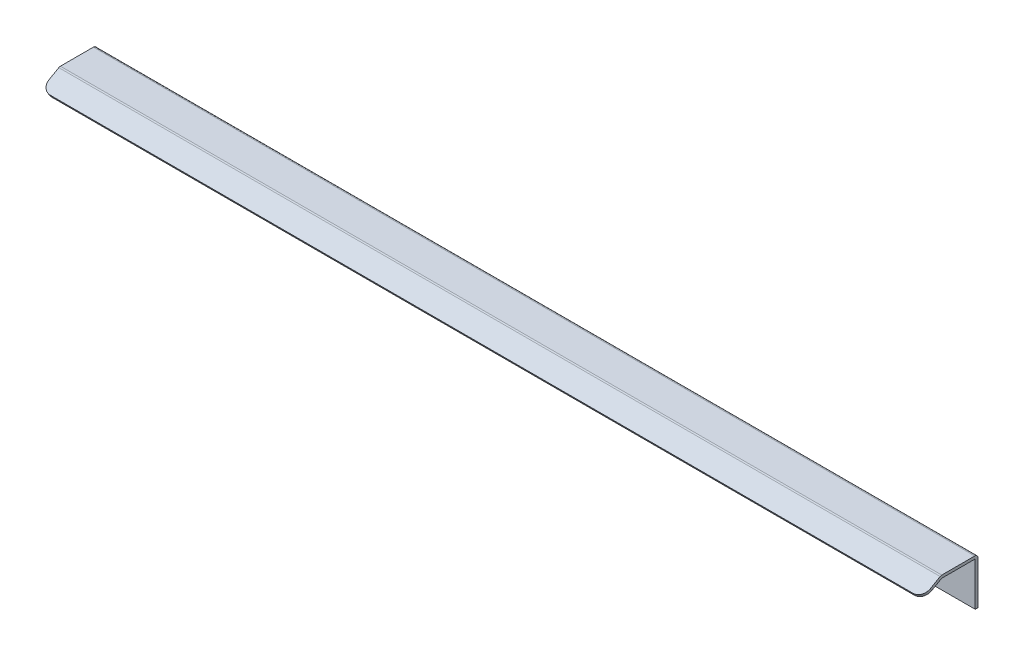
ISO-10303-21;
HEADER;
FILE_DESCRIPTION(('STEP AP214'),'2;1');
FILE_NAME('part.step','',(''),(''),'','','');
FILE_SCHEMA(('AUTOMOTIVE_DESIGN { 1 0 10303 214 1 1 1 1 }'));
ENDSEC;
DATA;
#1=APPLICATION_CONTEXT('core data for automotive mechanical design processes');
#2=APPLICATION_PROTOCOL_DEFINITION('international standard','automotive_design',2000,#1);
#3=PRODUCT_CONTEXT('',#1,'mechanical');
#4=PRODUCT('Part','Part','',(#3));
#5=PRODUCT_RELATED_PRODUCT_CATEGORY('part','',(#4));
#6=PRODUCT_DEFINITION_FORMATION('','',#4);
#7=PRODUCT_DEFINITION_CONTEXT('part definition',#1,'design');
#8=PRODUCT_DEFINITION('design','',#6,#7);
#9=PRODUCT_DEFINITION_SHAPE('','',#8);
#10=(LENGTH_UNIT() NAMED_UNIT(*) SI_UNIT(.MILLI.,.METRE.));
#11=(NAMED_UNIT(*) PLANE_ANGLE_UNIT() SI_UNIT($,.RADIAN.));
#12=(NAMED_UNIT(*) SI_UNIT($,.STERADIAN.) SOLID_ANGLE_UNIT());
#13=UNCERTAINTY_MEASURE_WITH_UNIT(LENGTH_MEASURE(1.E-05),#10,'distance_accuracy_value','');
#14=(GEOMETRIC_REPRESENTATION_CONTEXT(3) GLOBAL_UNCERTAINTY_ASSIGNED_CONTEXT((#13)) GLOBAL_UNIT_ASSIGNED_CONTEXT((#10,
#11,#12)) REPRESENTATION_CONTEXT('',''));
#15=CARTESIAN_POINT('',(0.,0.,0.));
#16=DIRECTION('',(0.,0.,1.));
#17=DIRECTION('',(1.,0.,0.));
#18=AXIS2_PLACEMENT_3D('',#15,#16,#17);
#19=CARTESIAN_POINT('',(949.6,46.5,0.));
#20=DIRECTION('',(1.,0.,0.));
#21=DIRECTION('',(0.,0.,-1.));
#22=AXIS2_PLACEMENT_3D('',#19,#20,#21);
#23=PLANE('',#22);
#24=CARTESIAN_POINT('',(949.6,46.5,3.5));
#25=DIRECTION('',(1.,0.,0.));
#26=DIRECTION('',(0.,1.,0.));
#27=AXIS2_PLACEMENT_3D('',#24,#25,#26);
#28=CIRCLE('',#27,0.5);
#29=CARTESIAN_POINT('',(949.6,46.5,3.));
#30=VERTEX_POINT('',#29);
#31=CARTESIAN_POINT('',(949.6,47.,3.5));
#32=VERTEX_POINT('',#31);
#33=EDGE_CURVE('E191',#30,#32,#28,.T.);
#34=ORIENTED_EDGE('',*,*,#33,.F.);
#35=DIRECTION('',(0.,1.,0.));
#36=VECTOR('',#35,1.);
#37=CARTESIAN_POINT('',(949.6,0.,3.));
#38=LINE('',#37,#36);
#39=CARTESIAN_POINT('',(949.6,0.,3.));
#40=VERTEX_POINT('',#39);
#41=EDGE_CURVE('E195',#40,#30,#38,.T.);
#42=ORIENTED_EDGE('',*,*,#41,.F.);
#43=DIRECTION('',(0.,0.,1.));
#44=VECTOR('',#43,1.);
#45=CARTESIAN_POINT('',(949.6,0.,0.));
#46=LINE('',#45,#44);
#47=CARTESIAN_POINT('',(949.6,0.,0.));
#48=VERTEX_POINT('',#47);
#49=EDGE_CURVE('E138',#48,#40,#46,.T.);
#50=ORIENTED_EDGE('',*,*,#49,.F.);
#51=DIRECTION('',(0.,1.,0.));
#52=VECTOR('',#51,1.);
#53=CARTESIAN_POINT('',(949.6,0.,0.));
#54=LINE('',#53,#52);
#55=CARTESIAN_POINT('',(949.6,46.5,0.));
#56=VERTEX_POINT('',#55);
#57=EDGE_CURVE('E25',#48,#56,#54,.T.);
#58=ORIENTED_EDGE('',*,*,#57,.T.);
#59=CARTESIAN_POINT('',(949.6,46.5,3.5));
#60=DIRECTION('',(1.,0.,0.));
#61=DIRECTION('',(0.,0.,1.));
#62=AXIS2_PLACEMENT_3D('',#59,#60,#61);
#63=CIRCLE('',#62,3.5);
#64=CARTESIAN_POINT('',(949.6,50.,3.5));
#65=VERTEX_POINT('',#64);
#66=EDGE_CURVE('E9',#56,#65,#63,.T.);
#67=ORIENTED_EDGE('',*,*,#66,.T.);
#68=DIRECTION('',(0.,0.,1.));
#69=VECTOR('',#68,1.);
#70=CARTESIAN_POINT('',(949.6,50.,3.5));
#71=LINE('',#70,#69);
#72=CARTESIAN_POINT('',(949.6,50.,39.0621778264911));
#73=VERTEX_POINT('',#72);
#74=EDGE_CURVE('E216',#65,#73,#71,.T.);
#75=ORIENTED_EDGE('',*,*,#74,.T.);
#76=CARTESIAN_POINT('',(949.6,46.5,39.0621778264911));
#77=DIRECTION('',(1.,0.,0.));
#78=DIRECTION('',(0.,0.,1.));
#79=AXIS2_PLACEMENT_3D('',#76,#77,#78);
#80=CIRCLE('',#79,3.5);
#81=CARTESIAN_POINT('',(949.6,49.5310889132455,40.8121778264911));
#82=VERTEX_POINT('',#81);
#83=EDGE_CURVE('E214',#73,#82,#80,.T.);
#84=ORIENTED_EDGE('',*,*,#83,.T.);
#85=DIRECTION('',(0.,-0.500000000000001,0.866025403784438));
#86=VECTOR('',#85,1.);
#87=CARTESIAN_POINT('',(949.6,49.5310889132455,40.8121778264911));
#88=LINE('',#87,#86);
#89=CARTESIAN_POINT('',(949.6,43.4529946162075,51.3397459621556));
#90=VERTEX_POINT('',#89);
#91=EDGE_CURVE('E149',#82,#90,#88,.T.);
#92=ORIENTED_EDGE('',*,*,#91,.T.);
#93=DIRECTION('',(0.,-0.866025403784439,-0.499999999999999));
#94=VECTOR('',#93,1.);
#95=CARTESIAN_POINT('',(949.6,40.8549184048542,49.8397459621556));
#96=LINE('',#95,#94);
#97=CARTESIAN_POINT('',(949.6,40.8549184048542,49.8397459621556));
#98=VERTEX_POINT('',#97);
#99=EDGE_CURVE('E19',#90,#98,#96,.T.);
#100=ORIENTED_EDGE('',*,*,#99,.T.);
#101=DIRECTION('',(0.,-0.5,0.866025403784439));
#102=VECTOR('',#101,1.);
#103=CARTESIAN_POINT('',(949.6,46.9330127018922,39.3121778264911));
#104=LINE('',#103,#102);
#105=CARTESIAN_POINT('',(949.6,46.9330127018922,39.3121778264911));
#106=VERTEX_POINT('',#105);
#107=EDGE_CURVE('E177',#106,#98,#104,.T.);
#108=ORIENTED_EDGE('',*,*,#107,.F.);
#109=CARTESIAN_POINT('',(949.6,46.5,39.0621778264911));
#110=DIRECTION('',(1.,0.,0.));
#111=DIRECTION('',(0.,1.,0.));
#112=AXIS2_PLACEMENT_3D('',#109,#110,#111);
#113=CIRCLE('',#112,0.5);
#114=CARTESIAN_POINT('',(949.6,47.,39.0621778264911));
#115=VERTEX_POINT('',#114);
#116=EDGE_CURVE('E181',#115,#106,#113,.T.);
#117=ORIENTED_EDGE('',*,*,#116,.F.);
#118=DIRECTION('',(0.,0.,1.));
#119=VECTOR('',#118,1.);
#120=CARTESIAN_POINT('',(949.6,47.,3.5));
#121=LINE('',#120,#119);
#122=EDGE_CURVE('E182',#32,#115,#121,.T.);
#123=ORIENTED_EDGE('',*,*,#122,.F.);
#124=EDGE_LOOP('',(#34,#42,#50,#58,#67,#75,#84,#92,#100,#108,#117,#123));
#125=FACE_BOUND('',#124,.T.);
#126=ADVANCED_FACE('F15',(#125),#23,.T.);
#127=CARTESIAN_POINT('',(0.,50.,3.5));
#128=DIRECTION('',(-1.,0.,0.));
#129=DIRECTION('',(0.,0.,1.));
#130=AXIS2_PLACEMENT_3D('',#127,#128,#129);
#131=PLANE('',#130);
#132=CARTESIAN_POINT('',(0.,46.5,3.5));
#133=DIRECTION('',(1.,0.,0.));
#134=DIRECTION('',(0.,1.,0.));
#135=AXIS2_PLACEMENT_3D('',#132,#133,#134);
#136=CIRCLE('',#135,0.5);
#137=CARTESIAN_POINT('',(0.,46.5,3.));
#138=VERTEX_POINT('',#137);
#139=CARTESIAN_POINT('',(0.,47.,3.5));
#140=VERTEX_POINT('',#139);
#141=EDGE_CURVE('E200',#138,#140,#136,.T.);
#142=ORIENTED_EDGE('',*,*,#141,.T.);
#143=DIRECTION('',(0.,0.,1.));
#144=VECTOR('',#143,1.);
#145=CARTESIAN_POINT('',(0.,47.,3.5));
#146=LINE('',#145,#144);
#147=CARTESIAN_POINT('',(0.,47.,39.0621778264911));
#148=VERTEX_POINT('',#147);
#149=EDGE_CURVE('E202',#140,#148,#146,.T.);
#150=ORIENTED_EDGE('',*,*,#149,.T.);
#151=CARTESIAN_POINT('',(0.,46.5,39.0621778264911));
#152=DIRECTION('',(1.,0.,0.));
#153=DIRECTION('',(0.,1.,0.));
#154=AXIS2_PLACEMENT_3D('',#151,#152,#153);
#155=CIRCLE('',#154,0.5);
#156=CARTESIAN_POINT('',(0.,46.9330127018922,39.3121778264911));
#157=VERTEX_POINT('',#156);
#158=EDGE_CURVE('E223',#148,#157,#155,.T.);
#159=ORIENTED_EDGE('',*,*,#158,.T.);
#160=DIRECTION('',(0.,-0.5,0.866025403784439));
#161=VECTOR('',#160,1.);
#162=CARTESIAN_POINT('',(0.,46.9330127018922,39.3121778264911));
#163=LINE('',#162,#161);
#164=CARTESIAN_POINT('',(0.,40.8549184048542,49.8397459621556));
#165=VERTEX_POINT('',#164);
#166=EDGE_CURVE('E226',#157,#165,#163,.T.);
#167=ORIENTED_EDGE('',*,*,#166,.T.);
#168=DIRECTION('',(0.,0.866025403784438,0.500000000000001));
#169=VECTOR('',#168,1.);
#170=CARTESIAN_POINT('',(0.,40.8549184048541,49.8397459621557));
#171=LINE('',#170,#169);
#172=CARTESIAN_POINT('',(0.,43.4529946162075,51.3397459621556));
#173=VERTEX_POINT('',#172);
#174=EDGE_CURVE('E229',#165,#173,#171,.T.);
#175=ORIENTED_EDGE('',*,*,#174,.T.);
#176=DIRECTION('',(0.,-0.500000000000001,0.866025403784438));
#177=VECTOR('',#176,1.);
#178=CARTESIAN_POINT('',(0.,49.5310889132455,40.8121778264911));
#179=LINE('',#178,#177);
#180=CARTESIAN_POINT('',(0.,49.5310889132455,40.8121778264911));
#181=VERTEX_POINT('',#180);
#182=EDGE_CURVE('E232',#181,#173,#179,.T.);
#183=ORIENTED_EDGE('',*,*,#182,.F.);
#184=CARTESIAN_POINT('',(0.,46.5,39.0621778264911));
#185=DIRECTION('',(1.,0.,0.));
#186=DIRECTION('',(0.,0.,1.));
#187=AXIS2_PLACEMENT_3D('',#184,#185,#186);
#188=CIRCLE('',#187,3.5);
#189=CARTESIAN_POINT('',(0.,50.,39.0621778264911));
#190=VERTEX_POINT('',#189);
#191=EDGE_CURVE('E146',#190,#181,#188,.T.);
#192=ORIENTED_EDGE('',*,*,#191,.F.);
#193=DIRECTION('',(0.,0.,1.));
#194=VECTOR('',#193,1.);
#195=CARTESIAN_POINT('',(0.,50.,3.5));
#196=LINE('',#195,#194);
#197=CARTESIAN_POINT('',(0.,50.,3.5));
#198=VERTEX_POINT('',#197);
#199=EDGE_CURVE('E143',#198,#190,#196,.T.);
#200=ORIENTED_EDGE('',*,*,#199,.F.);
#201=CARTESIAN_POINT('',(0.,46.5,3.5));
#202=DIRECTION('',(1.,0.,0.));
#203=DIRECTION('',(0.,0.,1.));
#204=AXIS2_PLACEMENT_3D('',#201,#202,#203);
#205=CIRCLE('',#204,3.5);
#206=CARTESIAN_POINT('',(0.,46.5,0.));
#207=VERTEX_POINT('',#206);
#208=EDGE_CURVE('E132',#207,#198,#205,.T.);
#209=ORIENTED_EDGE('',*,*,#208,.F.);
#210=DIRECTION('',(0.,1.,0.));
#211=VECTOR('',#210,1.);
#212=CARTESIAN_POINT('',(0.,0.,0.));
#213=LINE('',#212,#211);
#214=CARTESIAN_POINT('',(0.,0.,0.));
#215=VERTEX_POINT('',#214);
#216=EDGE_CURVE('E130',#215,#207,#213,.T.);
#217=ORIENTED_EDGE('',*,*,#216,.F.);
#218=DIRECTION('',(0.,0.,1.));
#219=VECTOR('',#218,1.);
#220=CARTESIAN_POINT('',(0.,0.,0.));
#221=LINE('',#220,#219);
#222=CARTESIAN_POINT('',(0.,0.,3.));
#223=VERTEX_POINT('',#222);
#224=EDGE_CURVE('E118',#215,#223,#221,.T.);
#225=ORIENTED_EDGE('',*,*,#224,.T.);
#226=DIRECTION('',(0.,1.,0.));
#227=VECTOR('',#226,1.);
#228=CARTESIAN_POINT('',(0.,0.,3.));
#229=LINE('',#228,#227);
#230=EDGE_CURVE('E112',#223,#138,#229,.T.);
#231=ORIENTED_EDGE('',*,*,#230,.T.);
#232=EDGE_LOOP('',(#142,#150,#159,#167,#175,#183,#192,#200,#209,#217,#225,#231));
#233=FACE_BOUND('',#232,.T.);
#234=ADVANCED_FACE('F135',(#233),#131,.T.);
#235=CARTESIAN_POINT('',(949.6,50.,40.));
#236=DIRECTION('',(0.,-0.866025403784438,-0.5));
#237=DIRECTION('',(0.,0.5,-0.866025403784438));
#238=AXIS2_PLACEMENT_3D('',#235,#236,#237);
#239=PLANE('',#238);
#240=ORIENTED_EDGE('',*,*,#182,.T.);
#241=CARTESIAN_POINT('',(10.,43.4529946162075,51.3397459621556));
#242=DIRECTION('',(0.,0.866025403784438,0.5));
#243=DIRECTION('',(0.,0.5,-0.866025403784438));
#244=AXIS2_PLACEMENT_3D('',#241,#242,#243);
#245=CIRCLE('',#244,9.99999999999999);
#246=CARTESIAN_POINT('',(10.0000000000002,38.4529946162074,60.));
#247=VERTEX_POINT('',#246);
#248=EDGE_CURVE('E234',#173,#247,#245,.T.);
#249=ORIENTED_EDGE('',*,*,#248,.T.);
#250=DIRECTION('',(-1.,0.,0.));
#251=VECTOR('',#250,1.);
#252=CARTESIAN_POINT('',(939.6,38.4529946162074,60.));
#253=LINE('',#252,#251);
#254=CARTESIAN_POINT('',(939.6,38.4529946162074,60.));
#255=VERTEX_POINT('',#254);
#256=EDGE_CURVE('E165',#255,#247,#253,.T.);
#257=ORIENTED_EDGE('',*,*,#256,.F.);
#258=CARTESIAN_POINT('',(939.6,43.4529946162075,51.3397459621556));
#259=DIRECTION('',(0.,0.866025403784438,0.5));
#260=DIRECTION('',(0.,0.5,-0.866025403784438));
#261=AXIS2_PLACEMENT_3D('',#258,#259,#260);
#262=CIRCLE('',#261,9.99999999999999);
#263=EDGE_CURVE('E160',#255,#90,#262,.T.);
#264=ORIENTED_EDGE('',*,*,#263,.T.);
#265=ORIENTED_EDGE('',*,*,#91,.F.);
#266=DIRECTION('',(-1.,0.,0.));
#267=VECTOR('',#266,1.);
#268=CARTESIAN_POINT('',(949.6,49.5310889132455,40.8121778264911));
#269=LINE('',#268,#267);
#270=EDGE_CURVE('E162',#82,#181,#269,.T.);
#271=ORIENTED_EDGE('',*,*,#270,.T.);
#272=EDGE_LOOP('',(#240,#249,#257,#264,#265,#271));
#273=FACE_BOUND('',#272,.T.);
#274=ADVANCED_FACE('F244',(#273),#239,.F.);
#275=CARTESIAN_POINT('',(949.6,35.8549184048541,58.5));
#276=DIRECTION('',(0.,-0.5,0.866025403784439));
#277=DIRECTION('',(0.,-0.866025403784439,-0.5));
#278=AXIS2_PLACEMENT_3D('',#275,#276,#277);
#279=PLANE('',#278);
#280=ORIENTED_EDGE('',*,*,#256,.T.);
#281=DIRECTION('',(0.,-0.866025403784439,-0.499999999999999));
#282=VECTOR('',#281,1.);
#283=CARTESIAN_POINT('',(10.,35.8549184048541,58.5));
#284=LINE('',#283,#282);
#285=CARTESIAN_POINT('',(10.0000000000002,35.8549184048541,58.5));
#286=VERTEX_POINT('',#285);
#287=EDGE_CURVE('E166',#247,#286,#284,.T.);
#288=ORIENTED_EDGE('',*,*,#287,.T.);
#289=DIRECTION('',(-1.,0.,0.));
#290=VECTOR('',#289,1.);
#291=CARTESIAN_POINT('',(939.6,35.8549184048541,58.5));
#292=LINE('',#291,#290);
#293=CARTESIAN_POINT('',(939.6,35.8549184048541,58.5));
#294=VERTEX_POINT('',#293);
#295=EDGE_CURVE('E170',#294,#286,#292,.T.);
#296=ORIENTED_EDGE('',*,*,#295,.F.);
#297=DIRECTION('',(0.,0.866025403784439,0.499999999999999));
#298=VECTOR('',#297,1.);
#299=CARTESIAN_POINT('',(939.6,35.8549184048541,58.5));
#300=LINE('',#299,#298);
#301=EDGE_CURVE('E169',#294,#255,#300,.T.);
#302=ORIENTED_EDGE('',*,*,#301,.T.);
#303=EDGE_LOOP('',(#280,#288,#296,#302));
#304=FACE_BOUND('',#303,.T.);
#305=ADVANCED_FACE('F237',(#304),#279,.T.);
#306=CARTESIAN_POINT('',(949.6,47.4019237886467,38.5));
#307=DIRECTION('',(0.,-0.866025403784438,-0.5));
#308=DIRECTION('',(0.,0.5,-0.866025403784438));
#309=AXIS2_PLACEMENT_3D('',#306,#307,#308);
#310=PLANE('',#309);
#311=ORIENTED_EDGE('',*,*,#295,.T.);
#312=CARTESIAN_POINT('',(10.,40.8549184048542,49.8397459621556));
#313=DIRECTION('',(0.,-0.866025403784438,-0.5));
#314=DIRECTION('',(0.,0.5,-0.866025403784438));
#315=AXIS2_PLACEMENT_3D('',#312,#313,#314);
#316=CIRCLE('',#315,9.99999999999999);
#317=EDGE_CURVE('E172',#286,#165,#316,.T.);
#318=ORIENTED_EDGE('',*,*,#317,.T.);
#319=ORIENTED_EDGE('',*,*,#166,.F.);
#320=DIRECTION('',(-1.,0.,0.));
#321=VECTOR('',#320,1.);
#322=CARTESIAN_POINT('',(949.6,46.9330127018922,39.3121778264911));
#323=LINE('',#322,#321);
#324=EDGE_CURVE('E178',#106,#157,#323,.T.);
#325=ORIENTED_EDGE('',*,*,#324,.F.);
#326=ORIENTED_EDGE('',*,*,#107,.T.);
#327=CARTESIAN_POINT('',(939.6,40.8549184048542,49.8397459621556));
#328=DIRECTION('',(0.,-0.866025403784438,-0.5));
#329=DIRECTION('',(0.,0.5,-0.866025403784438));
#330=AXIS2_PLACEMENT_3D('',#327,#328,#329);
#331=CIRCLE('',#330,9.99999999999999);
#332=EDGE_CURVE('E185',#98,#294,#331,.T.);
#333=ORIENTED_EDGE('',*,*,#332,.T.);
#334=EDGE_LOOP('',(#311,#318,#319,#325,#326,#333));
#335=FACE_BOUND('',#334,.T.);
#336=ADVANCED_FACE('F249',(#335),#310,.T.);
#337=CARTESIAN_POINT('',(949.6,46.5,39.0621778264911));
#338=DIRECTION('',(-1.,0.,0.));
#339=DIRECTION('',(0.,0.,1.));
#340=AXIS2_PLACEMENT_3D('',#337,#338,#339);
#341=CYLINDRICAL_SURFACE('',#340,0.5);
#342=ORIENTED_EDGE('',*,*,#158,.F.);
#343=DIRECTION('',(-1.,0.,0.));
#344=VECTOR('',#343,1.);
#345=CARTESIAN_POINT('',(949.6,47.,39.0621778264911));
#346=LINE('',#345,#344);
#347=EDGE_CURVE('E188',#115,#148,#346,.T.);
#348=ORIENTED_EDGE('',*,*,#347,.F.);
#349=ORIENTED_EDGE('',*,*,#116,.T.);
#350=ORIENTED_EDGE('',*,*,#324,.T.);
#351=EDGE_LOOP('',(#342,#348,#349,#350));
#352=FACE_BOUND('',#351,.T.);
#353=ADVANCED_FACE('F17',(#352),#341,.F.);
#354=CARTESIAN_POINT('',(949.6,47.,0.));
#355=DIRECTION('',(0.,-1.,0.));
#356=DIRECTION('',(0.,0.,-1.));
#357=AXIS2_PLACEMENT_3D('',#354,#355,#356);
#358=PLANE('',#357);
#359=ORIENTED_EDGE('',*,*,#149,.F.);
#360=DIRECTION('',(-1.,0.,0.));
#361=VECTOR('',#360,1.);
#362=CARTESIAN_POINT('',(949.6,47.,3.5));
#363=LINE('',#362,#361);
#364=EDGE_CURVE('E192',#32,#140,#363,.T.);
#365=ORIENTED_EDGE('',*,*,#364,.F.);
#366=ORIENTED_EDGE('',*,*,#122,.T.);
#367=ORIENTED_EDGE('',*,*,#347,.T.);
#368=EDGE_LOOP('',(#359,#365,#366,#367));
#369=FACE_BOUND('',#368,.T.);
#370=ADVANCED_FACE('F211',(#369),#358,.T.);
#371=CARTESIAN_POINT('',(949.6,46.5,3.5));
#372=DIRECTION('',(-1.,0.,0.));
#373=DIRECTION('',(0.,0.,1.));
#374=AXIS2_PLACEMENT_3D('',#371,#372,#373);
#375=CYLINDRICAL_SURFACE('',#374,0.5);
#376=ORIENTED_EDGE('',*,*,#141,.F.);
#377=DIRECTION('',(-1.,0.,0.));
#378=VECTOR('',#377,1.);
#379=CARTESIAN_POINT('',(949.6,46.5,3.));
#380=LINE('',#379,#378);
#381=EDGE_CURVE('E196',#30,#138,#380,.T.);
#382=ORIENTED_EDGE('',*,*,#381,.F.);
#383=ORIENTED_EDGE('',*,*,#33,.T.);
#384=ORIENTED_EDGE('',*,*,#364,.T.);
#385=EDGE_LOOP('',(#376,#382,#383,#384));
#386=FACE_BOUND('',#385,.T.);
#387=ADVANCED_FACE('F207',(#386),#375,.F.);
#388=CARTESIAN_POINT('',(949.6,0.,3.));
#389=DIRECTION('',(0.,0.,1.));
#390=DIRECTION('',(1.,0.,0.));
#391=AXIS2_PLACEMENT_3D('',#388,#389,#390);
#392=PLANE('',#391);
#393=ORIENTED_EDGE('',*,*,#230,.F.);
#394=DIRECTION('',(-1.,0.,0.));
#395=VECTOR('',#394,1.);
#396=CARTESIAN_POINT('',(949.6,0.,3.));
#397=LINE('',#396,#395);
#398=EDGE_CURVE('E122',#40,#223,#397,.T.);
#399=ORIENTED_EDGE('',*,*,#398,.F.);
#400=ORIENTED_EDGE('',*,*,#41,.T.);
#401=ORIENTED_EDGE('',*,*,#381,.T.);
#402=EDGE_LOOP('',(#393,#399,#400,#401));
#403=FACE_BOUND('',#402,.T.);
#404=ADVANCED_FACE('F260',(#403),#392,.T.);
#405=CARTESIAN_POINT('',(949.6,0.,0.));
#406=DIRECTION('',(0.,-1.,0.));
#407=DIRECTION('',(0.,0.,-1.));
#408=AXIS2_PLACEMENT_3D('',#405,#406,#407);
#409=PLANE('',#408);
#410=ORIENTED_EDGE('',*,*,#224,.F.);
#411=DIRECTION('',(-1.,0.,0.));
#412=VECTOR('',#411,1.);
#413=CARTESIAN_POINT('',(949.6,0.,0.));
#414=LINE('',#413,#412);
#415=EDGE_CURVE('E121',#48,#215,#414,.T.);
#416=ORIENTED_EDGE('',*,*,#415,.F.);
#417=ORIENTED_EDGE('',*,*,#49,.T.);
#418=ORIENTED_EDGE('',*,*,#398,.T.);
#419=EDGE_LOOP('',(#410,#416,#417,#418));
#420=FACE_BOUND('',#419,.T.);
#421=ADVANCED_FACE('F120',(#420),#409,.T.);
#422=CARTESIAN_POINT('',(949.6,0.,0.));
#423=DIRECTION('',(0.,0.,1.));
#424=DIRECTION('',(1.,0.,0.));
#425=AXIS2_PLACEMENT_3D('',#422,#423,#424);
#426=PLANE('',#425);
#427=ORIENTED_EDGE('',*,*,#216,.T.);
#428=DIRECTION('',(-1.,0.,0.));
#429=VECTOR('',#428,1.);
#430=CARTESIAN_POINT('',(949.6,46.5,0.));
#431=LINE('',#430,#429);
#432=EDGE_CURVE('E141',#56,#207,#431,.T.);
#433=ORIENTED_EDGE('',*,*,#432,.F.);
#434=ORIENTED_EDGE('',*,*,#57,.F.);
#435=ORIENTED_EDGE('',*,*,#415,.T.);
#436=EDGE_LOOP('',(#427,#433,#434,#435));
#437=FACE_BOUND('',#436,.T.);
#438=ADVANCED_FACE('F128',(#437),#426,.F.);
#439=CARTESIAN_POINT('',(949.6,46.5,3.5));
#440=DIRECTION('',(-1.,0.,0.));
#441=DIRECTION('',(0.,0.,1.));
#442=AXIS2_PLACEMENT_3D('',#439,#440,#441);
#443=CYLINDRICAL_SURFACE('',#442,3.5);
#444=ORIENTED_EDGE('',*,*,#208,.T.);
#445=DIRECTION('',(-1.,0.,0.));
#446=VECTOR('',#445,1.);
#447=CARTESIAN_POINT('',(949.6,50.,3.5));
#448=LINE('',#447,#446);
#449=EDGE_CURVE('E144',#65,#198,#448,.T.);
#450=ORIENTED_EDGE('',*,*,#449,.F.);
#451=ORIENTED_EDGE('',*,*,#66,.F.);
#452=ORIENTED_EDGE('',*,*,#432,.T.);
#453=EDGE_LOOP('',(#444,#450,#451,#452));
#454=FACE_BOUND('',#453,.T.);
#455=ADVANCED_FACE('F267',(#454),#443,.T.);
#456=CARTESIAN_POINT('',(949.6,50.,0.));
#457=DIRECTION('',(0.,-1.,0.));
#458=DIRECTION('',(0.,0.,-1.));
#459=AXIS2_PLACEMENT_3D('',#456,#457,#458);
#460=PLANE('',#459);
#461=ORIENTED_EDGE('',*,*,#199,.T.);
#462=DIRECTION('',(-1.,0.,0.));
#463=VECTOR('',#462,1.);
#464=CARTESIAN_POINT('',(949.6,50.,39.0621778264911));
#465=LINE('',#464,#463);
#466=EDGE_CURVE('E147',#73,#190,#465,.T.);
#467=ORIENTED_EDGE('',*,*,#466,.F.);
#468=ORIENTED_EDGE('',*,*,#74,.F.);
#469=ORIENTED_EDGE('',*,*,#449,.T.);
#470=EDGE_LOOP('',(#461,#467,#468,#469));
#471=FACE_BOUND('',#470,.T.);
#472=ADVANCED_FACE('F269',(#471),#460,.F.);
#473=CARTESIAN_POINT('',(949.6,46.5,39.0621778264911));
#474=DIRECTION('',(-1.,0.,0.));
#475=DIRECTION('',(0.,0.,1.));
#476=AXIS2_PLACEMENT_3D('',#473,#474,#475);
#477=CYLINDRICAL_SURFACE('',#476,3.5);
#478=ORIENTED_EDGE('',*,*,#191,.T.);
#479=ORIENTED_EDGE('',*,*,#270,.F.);
#480=ORIENTED_EDGE('',*,*,#83,.F.);
#481=ORIENTED_EDGE('',*,*,#466,.T.);
#482=EDGE_LOOP('',(#478,#479,#480,#481));
#483=FACE_BOUND('',#482,.T.);
#484=ADVANCED_FACE('F254',(#483),#477,.T.);
#485=CARTESIAN_POINT('',(10.,40.7969057029619,49.8062523131018));
#486=DIRECTION('',(0.,0.866025403784439,0.5));
#487=DIRECTION('',(1.,0.,0.));
#488=AXIS2_PLACEMENT_3D('',#485,#486,#487);
#489=CYLINDRICAL_SURFACE('',#488,10.);
#490=ORIENTED_EDGE('',*,*,#317,.F.);
#491=ORIENTED_EDGE('',*,*,#287,.F.);
#492=ORIENTED_EDGE('',*,*,#248,.F.);
#493=ORIENTED_EDGE('',*,*,#174,.F.);
#494=EDGE_LOOP('',(#490,#491,#492,#493));
#495=FACE_BOUND('',#494,.T.);
#496=ADVANCED_FACE('F247',(#495),#489,.T.);
#497=CARTESIAN_POINT('',(939.6,40.8549184048541,49.8397459621556));
#498=DIRECTION('',(0.,0.866025403784439,0.5));
#499=DIRECTION('',(1.,0.,0.));
#500=AXIS2_PLACEMENT_3D('',#497,#498,#499);
#501=CYLINDRICAL_SURFACE('',#500,10.);
#502=ORIENTED_EDGE('',*,*,#332,.F.);
#503=ORIENTED_EDGE('',*,*,#99,.F.);
#504=ORIENTED_EDGE('',*,*,#263,.F.);
#505=ORIENTED_EDGE('',*,*,#301,.F.);
#506=EDGE_LOOP('',(#502,#503,#504,#505));
#507=FACE_BOUND('',#506,.T.);
#508=ADVANCED_FACE('F251',(#507),#501,.T.);
#509=CLOSED_SHELL('',(#126,#234,#274,#305,#336,#353,#370,#387,#404,#421,#438,#455,#472,#484,
#496,#508));
#510=MANIFOLD_SOLID_BREP('B1',#509);
#511=ADVANCED_BREP_SHAPE_REPRESENTATION('',(#18,#510),#14);
#512=SHAPE_DEFINITION_REPRESENTATION(#9,#511);
ENDSEC;
END-ISO-10303-21;
